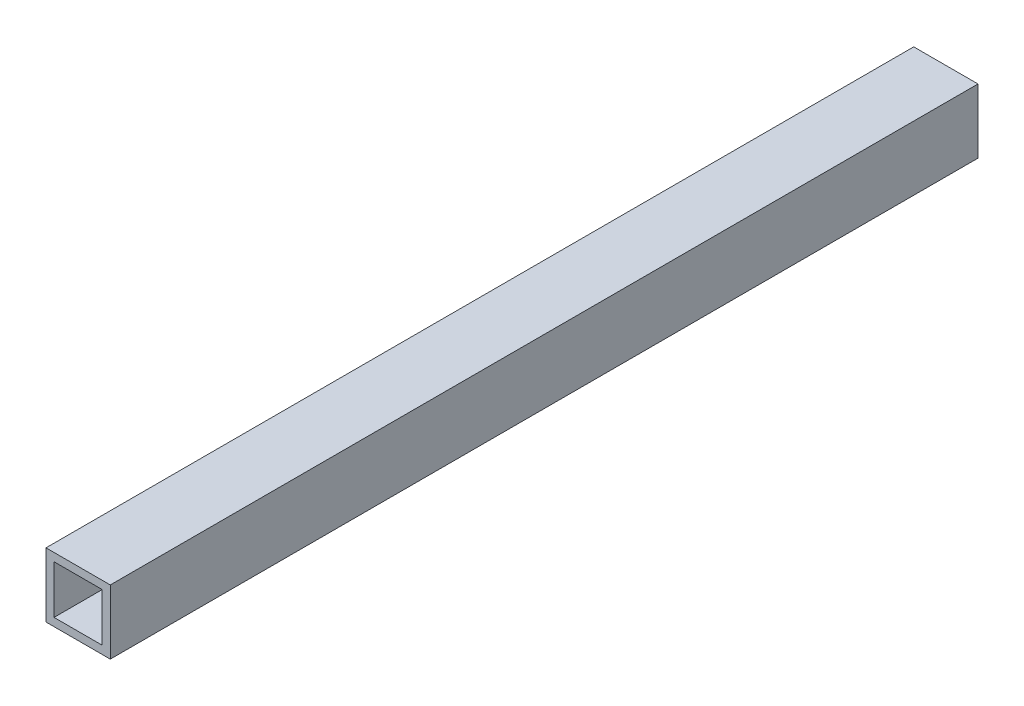
ISO-10303-21;
HEADER;
FILE_DESCRIPTION(('STEP AP214'),'2;1');
FILE_NAME('part.step','',(''),(''),'','','');
FILE_SCHEMA(('AUTOMOTIVE_DESIGN { 1 0 10303 214 1 1 1 1 }'));
ENDSEC;
DATA;
#1=APPLICATION_CONTEXT('core data for automotive mechanical design processes');
#2=APPLICATION_PROTOCOL_DEFINITION('international standard','automotive_design',2000,#1);
#3=PRODUCT_CONTEXT('',#1,'mechanical');
#4=PRODUCT('Part','Part','',(#3));
#5=PRODUCT_RELATED_PRODUCT_CATEGORY('part','',(#4));
#6=PRODUCT_DEFINITION_FORMATION('','',#4);
#7=PRODUCT_DEFINITION_CONTEXT('part definition',#1,'design');
#8=PRODUCT_DEFINITION('design','',#6,#7);
#9=PRODUCT_DEFINITION_SHAPE('','',#8);
#10=(LENGTH_UNIT() NAMED_UNIT(*) SI_UNIT(.MILLI.,.METRE.));
#11=(NAMED_UNIT(*) PLANE_ANGLE_UNIT() SI_UNIT($,.RADIAN.));
#12=(NAMED_UNIT(*) SI_UNIT($,.STERADIAN.) SOLID_ANGLE_UNIT());
#13=UNCERTAINTY_MEASURE_WITH_UNIT(LENGTH_MEASURE(1.E-05),#10,'distance_accuracy_value','');
#14=(GEOMETRIC_REPRESENTATION_CONTEXT(3) GLOBAL_UNCERTAINTY_ASSIGNED_CONTEXT((#13)) GLOBAL_UNIT_ASSIGNED_CONTEXT((#10,
#11,#12)) REPRESENTATION_CONTEXT('',''));
#15=CARTESIAN_POINT('',(0.,0.,0.));
#16=DIRECTION('',(0.,0.,1.));
#17=DIRECTION('',(1.,0.,0.));
#18=AXIS2_PLACEMENT_3D('',#15,#16,#17);
#19=CARTESIAN_POINT('',(0.,0.,342.9));
#20=DIRECTION('',(0.,0.,-1.));
#21=DIRECTION('',(-1.,0.,0.));
#22=AXIS2_PLACEMENT_3D('',#19,#20,#21);
#23=PLANE('',#22);
#24=DIRECTION('',(0.,-1.,0.));
#25=VECTOR('',#24,1.);
#26=CARTESIAN_POINT('',(0.,0.,342.9));
#27=LINE('',#26,#25);
#28=CARTESIAN_POINT('',(0.,25.4,342.9));
#29=VERTEX_POINT('',#28);
#30=CARTESIAN_POINT('',(0.,0.,342.9));
#31=VERTEX_POINT('',#30);
#32=EDGE_CURVE('E134',#29,#31,#27,.T.);
#33=ORIENTED_EDGE('',*,*,#32,.T.);
#34=DIRECTION('',(1.,0.,0.));
#35=VECTOR('',#34,1.);
#36=CARTESIAN_POINT('',(0.,0.,342.9));
#37=LINE('',#36,#35);
#38=CARTESIAN_POINT('',(25.4,0.,342.9));
#39=VERTEX_POINT('',#38);
#40=EDGE_CURVE('E137',#31,#39,#37,.T.);
#41=ORIENTED_EDGE('',*,*,#40,.T.);
#42=DIRECTION('',(0.,1.,0.));
#43=VECTOR('',#42,1.);
#44=CARTESIAN_POINT('',(25.4,0.,342.9));
#45=LINE('',#44,#43);
#46=CARTESIAN_POINT('',(25.4,25.4,342.9));
#47=VERTEX_POINT('',#46);
#48=EDGE_CURVE('E140',#39,#47,#45,.T.);
#49=ORIENTED_EDGE('',*,*,#48,.T.);
#50=DIRECTION('',(-1.,0.,0.));
#51=VECTOR('',#50,1.);
#52=CARTESIAN_POINT('',(0.,25.4,342.9));
#53=LINE('',#52,#51);
#54=EDGE_CURVE('E142',#47,#29,#53,.T.);
#55=ORIENTED_EDGE('',*,*,#54,.T.);
#56=EDGE_LOOP('',(#33,#41,#49,#55));
#57=FACE_BOUND('',#56,.T.);
#58=DIRECTION('',(0.,-1.,0.));
#59=VECTOR('',#58,1.);
#60=CARTESIAN_POINT('',(3.175,3.175,342.9));
#61=LINE('',#60,#59);
#62=CARTESIAN_POINT('',(3.175,22.225,342.9));
#63=VERTEX_POINT('',#62);
#64=CARTESIAN_POINT('',(3.175,3.175,342.9));
#65=VERTEX_POINT('',#64);
#66=EDGE_CURVE('E98',#63,#65,#61,.T.);
#67=ORIENTED_EDGE('',*,*,#66,.F.);
#68=DIRECTION('',(-1.,0.,0.));
#69=VECTOR('',#68,1.);
#70=CARTESIAN_POINT('',(3.175,22.225,342.9));
#71=LINE('',#70,#69);
#72=CARTESIAN_POINT('',(22.225,22.225,342.9));
#73=VERTEX_POINT('',#72);
#74=EDGE_CURVE('E120',#73,#63,#71,.T.);
#75=ORIENTED_EDGE('',*,*,#74,.F.);
#76=DIRECTION('',(0.,1.,0.));
#77=VECTOR('',#76,1.);
#78=CARTESIAN_POINT('',(22.225,3.175,342.9));
#79=LINE('',#78,#77);
#80=CARTESIAN_POINT('',(22.225,3.175,342.9));
#81=VERTEX_POINT('',#80);
#82=EDGE_CURVE('E118',#81,#73,#79,.T.);
#83=ORIENTED_EDGE('',*,*,#82,.F.);
#84=DIRECTION('',(1.,0.,0.));
#85=VECTOR('',#84,1.);
#86=CARTESIAN_POINT('',(3.175,3.175,342.9));
#87=LINE('',#86,#85);
#88=EDGE_CURVE('E106',#65,#81,#87,.T.);
#89=ORIENTED_EDGE('',*,*,#88,.F.);
#90=EDGE_LOOP('',(#67,#75,#83,#89));
#91=FACE_BOUND('',#90,.T.);
#92=ADVANCED_FACE('F33',(#57,#91),#23,.F.);
#93=CARTESIAN_POINT('',(0.,0.,0.));
#94=DIRECTION('',(0.,0.,-1.));
#95=DIRECTION('',(-1.,0.,0.));
#96=AXIS2_PLACEMENT_3D('',#93,#94,#95);
#97=PLANE('',#96);
#98=DIRECTION('',(0.,-1.,0.));
#99=VECTOR('',#98,1.);
#100=CARTESIAN_POINT('',(0.,0.,0.));
#101=LINE('',#100,#99);
#102=CARTESIAN_POINT('',(0.,25.4,0.));
#103=VERTEX_POINT('',#102);
#104=CARTESIAN_POINT('',(0.,0.,0.));
#105=VERTEX_POINT('',#104);
#106=EDGE_CURVE('E114',#103,#105,#101,.T.);
#107=ORIENTED_EDGE('',*,*,#106,.F.);
#108=DIRECTION('',(-1.,0.,0.));
#109=VECTOR('',#108,1.);
#110=CARTESIAN_POINT('',(0.,25.4,0.));
#111=LINE('',#110,#109);
#112=CARTESIAN_POINT('',(25.4,25.4,0.));
#113=VERTEX_POINT('',#112);
#114=EDGE_CURVE('E138',#113,#103,#111,.T.);
#115=ORIENTED_EDGE('',*,*,#114,.F.);
#116=DIRECTION('',(0.,1.,0.));
#117=VECTOR('',#116,1.);
#118=CARTESIAN_POINT('',(25.4,0.,0.));
#119=LINE('',#118,#117);
#120=CARTESIAN_POINT('',(25.4,0.,0.));
#121=VERTEX_POINT('',#120);
#122=EDGE_CURVE('E149',#121,#113,#119,.T.);
#123=ORIENTED_EDGE('',*,*,#122,.F.);
#124=DIRECTION('',(1.,0.,0.));
#125=VECTOR('',#124,1.);
#126=CARTESIAN_POINT('',(0.,0.,0.));
#127=LINE('',#126,#125);
#128=EDGE_CURVE('E147',#105,#121,#127,.T.);
#129=ORIENTED_EDGE('',*,*,#128,.F.);
#130=EDGE_LOOP('',(#107,#115,#123,#129));
#131=FACE_BOUND('',#130,.T.);
#132=DIRECTION('',(-1.,0.,0.));
#133=VECTOR('',#132,1.);
#134=CARTESIAN_POINT('',(3.175,22.225,0.));
#135=LINE('',#134,#133);
#136=CARTESIAN_POINT('',(22.225,22.225,0.));
#137=VERTEX_POINT('',#136);
#138=CARTESIAN_POINT('',(3.175,22.225,0.));
#139=VERTEX_POINT('',#138);
#140=EDGE_CURVE('E107',#137,#139,#135,.T.);
#141=ORIENTED_EDGE('',*,*,#140,.T.);
#142=DIRECTION('',(0.,-1.,0.));
#143=VECTOR('',#142,1.);
#144=CARTESIAN_POINT('',(3.175,3.175,0.));
#145=LINE('',#144,#143);
#146=CARTESIAN_POINT('',(3.175,3.175,0.));
#147=VERTEX_POINT('',#146);
#148=EDGE_CURVE('E56',#139,#147,#145,.T.);
#149=ORIENTED_EDGE('',*,*,#148,.T.);
#150=DIRECTION('',(1.,0.,0.));
#151=VECTOR('',#150,1.);
#152=CARTESIAN_POINT('',(3.175,3.175,0.));
#153=LINE('',#152,#151);
#154=CARTESIAN_POINT('',(22.225,3.175,0.));
#155=VERTEX_POINT('',#154);
#156=EDGE_CURVE('E113',#147,#155,#153,.T.);
#157=ORIENTED_EDGE('',*,*,#156,.T.);
#158=DIRECTION('',(0.,1.,0.));
#159=VECTOR('',#158,1.);
#160=CARTESIAN_POINT('',(22.225,3.175,0.));
#161=LINE('',#160,#159);
#162=EDGE_CURVE('E126',#155,#137,#161,.T.);
#163=ORIENTED_EDGE('',*,*,#162,.T.);
#164=EDGE_LOOP('',(#141,#149,#157,#163));
#165=FACE_BOUND('',#164,.T.);
#166=ADVANCED_FACE('F167',(#131,#165),#97,.T.);
#167=CARTESIAN_POINT('',(0.,0.,342.9));
#168=DIRECTION('',(1.,0.,0.));
#169=DIRECTION('',(0.,0.,-1.));
#170=AXIS2_PLACEMENT_3D('',#167,#168,#169);
#171=PLANE('',#170);
#172=ORIENTED_EDGE('',*,*,#106,.T.);
#173=DIRECTION('',(0.,0.,-1.));
#174=VECTOR('',#173,1.);
#175=CARTESIAN_POINT('',(0.,0.,342.9));
#176=LINE('',#175,#174);
#177=EDGE_CURVE('E11',#31,#105,#176,.T.);
#178=ORIENTED_EDGE('',*,*,#177,.F.);
#179=ORIENTED_EDGE('',*,*,#32,.F.);
#180=DIRECTION('',(0.,0.,-1.));
#181=VECTOR('',#180,1.);
#182=CARTESIAN_POINT('',(0.,25.4,342.9));
#183=LINE('',#182,#181);
#184=EDGE_CURVE('E144',#29,#103,#183,.T.);
#185=ORIENTED_EDGE('',*,*,#184,.T.);
#186=EDGE_LOOP('',(#172,#178,#179,#185));
#187=FACE_BOUND('',#186,.T.);
#188=ADVANCED_FACE('F35',(#187),#171,.F.);
#189=CARTESIAN_POINT('',(0.,0.,342.9));
#190=DIRECTION('',(0.,1.,0.));
#191=DIRECTION('',(0.,0.,1.));
#192=AXIS2_PLACEMENT_3D('',#189,#190,#191);
#193=PLANE('',#192);
#194=ORIENTED_EDGE('',*,*,#128,.T.);
#195=DIRECTION('',(0.,0.,-1.));
#196=VECTOR('',#195,1.);
#197=CARTESIAN_POINT('',(25.4,0.,342.9));
#198=LINE('',#197,#196);
#199=EDGE_CURVE('E41',#39,#121,#198,.T.);
#200=ORIENTED_EDGE('',*,*,#199,.F.);
#201=ORIENTED_EDGE('',*,*,#40,.F.);
#202=ORIENTED_EDGE('',*,*,#177,.T.);
#203=EDGE_LOOP('',(#194,#200,#201,#202));
#204=FACE_BOUND('',#203,.T.);
#205=ADVANCED_FACE('F177',(#204),#193,.F.);
#206=CARTESIAN_POINT('',(25.4,0.,342.9));
#207=DIRECTION('',(-1.,0.,0.));
#208=DIRECTION('',(0.,0.,1.));
#209=AXIS2_PLACEMENT_3D('',#206,#207,#208);
#210=PLANE('',#209);
#211=ORIENTED_EDGE('',*,*,#122,.T.);
#212=DIRECTION('',(0.,0.,-1.));
#213=VECTOR('',#212,1.);
#214=CARTESIAN_POINT('',(25.4,25.4,342.9));
#215=LINE('',#214,#213);
#216=EDGE_CURVE('E154',#47,#113,#215,.T.);
#217=ORIENTED_EDGE('',*,*,#216,.F.);
#218=ORIENTED_EDGE('',*,*,#48,.F.);
#219=ORIENTED_EDGE('',*,*,#199,.T.);
#220=EDGE_LOOP('',(#211,#217,#218,#219));
#221=FACE_BOUND('',#220,.T.);
#222=ADVANCED_FACE('F161',(#221),#210,.F.);
#223=CARTESIAN_POINT('',(0.,25.4,342.9));
#224=DIRECTION('',(0.,-1.,0.));
#225=DIRECTION('',(0.,0.,-1.));
#226=AXIS2_PLACEMENT_3D('',#223,#224,#225);
#227=PLANE('',#226);
#228=ORIENTED_EDGE('',*,*,#114,.T.);
#229=ORIENTED_EDGE('',*,*,#184,.F.);
#230=ORIENTED_EDGE('',*,*,#54,.F.);
#231=ORIENTED_EDGE('',*,*,#216,.T.);
#232=EDGE_LOOP('',(#228,#229,#230,#231));
#233=FACE_BOUND('',#232,.T.);
#234=ADVANCED_FACE('F171',(#233),#227,.F.);
#235=CARTESIAN_POINT('',(3.175,3.175,342.9));
#236=DIRECTION('',(1.,0.,0.));
#237=DIRECTION('',(0.,0.,-1.));
#238=AXIS2_PLACEMENT_3D('',#235,#236,#237);
#239=PLANE('',#238);
#240=ORIENTED_EDGE('',*,*,#148,.F.);
#241=DIRECTION('',(0.,0.,-1.));
#242=VECTOR('',#241,1.);
#243=CARTESIAN_POINT('',(3.175,22.225,342.9));
#244=LINE('',#243,#242);
#245=EDGE_CURVE('E102',#63,#139,#244,.T.);
#246=ORIENTED_EDGE('',*,*,#245,.F.);
#247=ORIENTED_EDGE('',*,*,#66,.T.);
#248=DIRECTION('',(0.,0.,-1.));
#249=VECTOR('',#248,1.);
#250=CARTESIAN_POINT('',(3.175,3.175,342.9));
#251=LINE('',#250,#249);
#252=EDGE_CURVE('E101',#65,#147,#251,.T.);
#253=ORIENTED_EDGE('',*,*,#252,.T.);
#254=EDGE_LOOP('',(#240,#246,#247,#253));
#255=FACE_BOUND('',#254,.T.);
#256=ADVANCED_FACE('F100',(#255),#239,.T.);
#257=CARTESIAN_POINT('',(3.175,3.175,342.9));
#258=DIRECTION('',(0.,1.,0.));
#259=DIRECTION('',(0.,0.,1.));
#260=AXIS2_PLACEMENT_3D('',#257,#258,#259);
#261=PLANE('',#260);
#262=ORIENTED_EDGE('',*,*,#156,.F.);
#263=ORIENTED_EDGE('',*,*,#252,.F.);
#264=ORIENTED_EDGE('',*,*,#88,.T.);
#265=DIRECTION('',(0.,0.,-1.));
#266=VECTOR('',#265,1.);
#267=CARTESIAN_POINT('',(22.225,3.175,342.9));
#268=LINE('',#267,#266);
#269=EDGE_CURVE('E115',#81,#155,#268,.T.);
#270=ORIENTED_EDGE('',*,*,#269,.T.);
#271=EDGE_LOOP('',(#262,#263,#264,#270));
#272=FACE_BOUND('',#271,.T.);
#273=ADVANCED_FACE('F110',(#272),#261,.T.);
#274=CARTESIAN_POINT('',(22.225,3.175,342.9));
#275=DIRECTION('',(-1.,0.,0.));
#276=DIRECTION('',(0.,0.,1.));
#277=AXIS2_PLACEMENT_3D('',#274,#275,#276);
#278=PLANE('',#277);
#279=ORIENTED_EDGE('',*,*,#162,.F.);
#280=ORIENTED_EDGE('',*,*,#269,.F.);
#281=ORIENTED_EDGE('',*,*,#82,.T.);
#282=DIRECTION('',(0.,0.,-1.));
#283=VECTOR('',#282,1.);
#284=CARTESIAN_POINT('',(22.225,22.225,342.9));
#285=LINE('',#284,#283);
#286=EDGE_CURVE('E48',#73,#137,#285,.T.);
#287=ORIENTED_EDGE('',*,*,#286,.T.);
#288=EDGE_LOOP('',(#279,#280,#281,#287));
#289=FACE_BOUND('',#288,.T.);
#290=ADVANCED_FACE('F200',(#289),#278,.T.);
#291=CARTESIAN_POINT('',(3.175,22.225,342.9));
#292=DIRECTION('',(0.,-1.,0.));
#293=DIRECTION('',(0.,0.,-1.));
#294=AXIS2_PLACEMENT_3D('',#291,#292,#293);
#295=PLANE('',#294);
#296=ORIENTED_EDGE('',*,*,#140,.F.);
#297=ORIENTED_EDGE('',*,*,#286,.F.);
#298=ORIENTED_EDGE('',*,*,#74,.T.);
#299=ORIENTED_EDGE('',*,*,#245,.T.);
#300=EDGE_LOOP('',(#296,#297,#298,#299));
#301=FACE_BOUND('',#300,.T.);
#302=ADVANCED_FACE('F204',(#301),#295,.T.);
#303=CLOSED_SHELL('',(#92,#166,#188,#205,#222,#234,#256,#273,#290,#302));
#304=MANIFOLD_SOLID_BREP('B2',#303);
#305=ADVANCED_BREP_SHAPE_REPRESENTATION('',(#18,#304),#14);
#306=SHAPE_DEFINITION_REPRESENTATION(#9,#305);
ENDSEC;
END-ISO-10303-21;
